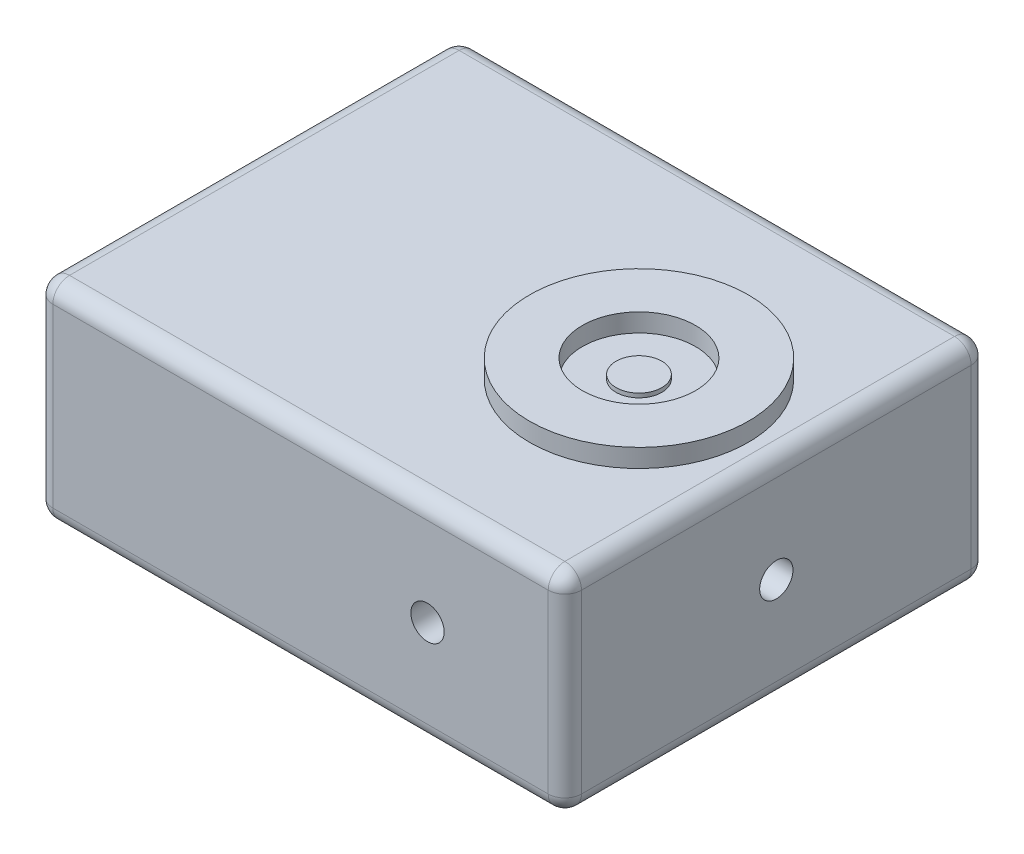
ISO-10303-21;
HEADER;
FILE_DESCRIPTION(('STEP AP214'),'2;1');
FILE_NAME('part.step','',(''),(''),'','','');
FILE_SCHEMA(('AUTOMOTIVE_DESIGN { 1 0 10303 214 1 1 1 1 }'));
ENDSEC;
DATA;
#1=APPLICATION_CONTEXT('core data for automotive mechanical design processes');
#2=APPLICATION_PROTOCOL_DEFINITION('international standard','automotive_design',2000,#1);
#3=PRODUCT_CONTEXT('',#1,'mechanical');
#4=PRODUCT('Part','Part','',(#3));
#5=PRODUCT_RELATED_PRODUCT_CATEGORY('part','',(#4));
#6=PRODUCT_DEFINITION_FORMATION('','',#4);
#7=PRODUCT_DEFINITION_CONTEXT('part definition',#1,'design');
#8=PRODUCT_DEFINITION('design','',#6,#7);
#9=PRODUCT_DEFINITION_SHAPE('','',#8);
#10=(LENGTH_UNIT() NAMED_UNIT(*) SI_UNIT(.MILLI.,.METRE.));
#11=(NAMED_UNIT(*) PLANE_ANGLE_UNIT() SI_UNIT($,.RADIAN.));
#12=(NAMED_UNIT(*) SI_UNIT($,.STERADIAN.) SOLID_ANGLE_UNIT());
#13=UNCERTAINTY_MEASURE_WITH_UNIT(LENGTH_MEASURE(1.E-05),#10,'distance_accuracy_value','');
#14=(GEOMETRIC_REPRESENTATION_CONTEXT(3) GLOBAL_UNCERTAINTY_ASSIGNED_CONTEXT((#13)) GLOBAL_UNIT_ASSIGNED_CONTEXT((#10,
#11,#12)) REPRESENTATION_CONTEXT('',''));
#15=CARTESIAN_POINT('',(0.,0.,0.));
#16=DIRECTION('',(0.,0.,1.));
#17=DIRECTION('',(1.,0.,0.));
#18=AXIS2_PLACEMENT_3D('',#15,#16,#17);
#19=CARTESIAN_POINT('',(-31.75,25.2,-25.4));
#20=DIRECTION('',(0.,0.,1.));
#21=DIRECTION('',(1.,0.,0.));
#22=AXIS2_PLACEMENT_3D('',#19,#20,#21);
#23=PLANE('',#22);
#24=CARTESIAN_POINT('',(15.25,12.6,-25.4));
#25=DIRECTION('',(0.,0.,-1.));
#26=DIRECTION('',(-1.,0.,0.));
#27=AXIS2_PLACEMENT_3D('',#24,#25,#26);
#28=CIRCLE('',#27,2.);
#29=CARTESIAN_POINT('',(13.25,12.6,-25.4));
#30=VERTEX_POINT('',#29);
#31=EDGE_CURVE('E184',#30,#30,#28,.T.);
#32=ORIENTED_EDGE('',*,*,#31,.F.);
#33=EDGE_LOOP('',(#32));
#34=FACE_BOUND('',#33,.T.);
#35=DIRECTION('',(-1.,0.,0.));
#36=VECTOR('',#35,1.);
#37=CARTESIAN_POINT('',(-31.75,2.,-25.4));
#38=LINE('',#37,#36);
#39=CARTESIAN_POINT('',(29.75,2.,-25.4));
#40=VERTEX_POINT('',#39);
#41=CARTESIAN_POINT('',(-29.75,2.,-25.4));
#42=VERTEX_POINT('',#41);
#43=EDGE_CURVE('E233',#40,#42,#38,.T.);
#44=ORIENTED_EDGE('',*,*,#43,.T.);
#45=DIRECTION('',(0.,-1.,0.));
#46=VECTOR('',#45,1.);
#47=CARTESIAN_POINT('',(-29.75,25.2,-25.4));
#48=LINE('',#47,#46);
#49=CARTESIAN_POINT('',(-29.75,23.2,-25.4));
#50=VERTEX_POINT('',#49);
#51=EDGE_CURVE('E236',#42,#50,#48,.F.);
#52=ORIENTED_EDGE('',*,*,#51,.T.);
#53=DIRECTION('',(-1.,0.,0.));
#54=VECTOR('',#53,1.);
#55=CARTESIAN_POINT('',(-31.75,23.2,-25.4));
#56=LINE('',#55,#54);
#57=CARTESIAN_POINT('',(29.75,23.2,-25.4));
#58=VERTEX_POINT('',#57);
#59=EDGE_CURVE('E231',#50,#58,#56,.F.);
#60=ORIENTED_EDGE('',*,*,#59,.T.);
#61=DIRECTION('',(0.,-1.,0.));
#62=VECTOR('',#61,1.);
#63=CARTESIAN_POINT('',(29.75,25.2,-25.4));
#64=LINE('',#63,#62);
#65=EDGE_CURVE('E229',#58,#40,#64,.T.);
#66=ORIENTED_EDGE('',*,*,#65,.T.);
#67=EDGE_LOOP('',(#44,#52,#60,#66));
#68=FACE_BOUND('',#67,.T.);
#69=DIRECTION('',(0.,1.,0.));
#70=VECTOR('',#69,1.);
#71=CARTESIAN_POINT('',(-25.25,2.5,-25.4));
#72=LINE('',#71,#70);
#73=CARTESIAN_POINT('',(-25.25,2.5,-25.4));
#74=VERTEX_POINT('',#73);
#75=CARTESIAN_POINT('',(-25.25,14.5,-25.4));
#76=VERTEX_POINT('',#75);
#77=EDGE_CURVE('E171',#74,#76,#72,.T.);
#78=ORIENTED_EDGE('',*,*,#77,.F.);
#79=DIRECTION('',(-1.,0.,0.));
#80=VECTOR('',#79,1.);
#81=CARTESIAN_POINT('',(-7.25,2.5,-25.4));
#82=LINE('',#81,#80);
#83=CARTESIAN_POINT('',(-7.25,2.5,-25.4));
#84=VERTEX_POINT('',#83);
#85=EDGE_CURVE('E168',#84,#74,#82,.T.);
#86=ORIENTED_EDGE('',*,*,#85,.F.);
#87=DIRECTION('',(0.,-1.,0.));
#88=VECTOR('',#87,1.);
#89=CARTESIAN_POINT('',(-7.25,2.5,-25.4));
#90=LINE('',#89,#88);
#91=CARTESIAN_POINT('',(-7.25,14.5,-25.4));
#92=VERTEX_POINT('',#91);
#93=EDGE_CURVE('E58',#92,#84,#90,.T.);
#94=ORIENTED_EDGE('',*,*,#93,.F.);
#95=DIRECTION('',(1.,0.,0.));
#96=VECTOR('',#95,1.);
#97=CARTESIAN_POINT('',(-7.25,14.5,-25.4));
#98=LINE('',#97,#96);
#99=EDGE_CURVE('E53',#76,#92,#98,.T.);
#100=ORIENTED_EDGE('',*,*,#99,.F.);
#101=EDGE_LOOP('',(#78,#86,#94,#100));
#102=FACE_BOUND('',#101,.T.);
#103=ADVANCED_FACE('F38',(#34,#68,#102),#23,.F.);
#104=CARTESIAN_POINT('',(31.75,25.2,25.4));
#105=DIRECTION('',(-1.,0.,0.));
#106=DIRECTION('',(0.,0.,1.));
#107=AXIS2_PLACEMENT_3D('',#104,#105,#106);
#108=PLANE('',#107);
#109=DIRECTION('',(0.,-1.,0.));
#110=VECTOR('',#109,1.);
#111=CARTESIAN_POINT('',(31.75,25.2,23.4));
#112=LINE('',#111,#110);
#113=CARTESIAN_POINT('',(31.75,23.2,23.4));
#114=VERTEX_POINT('',#113);
#115=CARTESIAN_POINT('',(31.75,2.,23.4));
#116=VERTEX_POINT('',#115);
#117=EDGE_CURVE('E215',#114,#116,#112,.T.);
#118=ORIENTED_EDGE('',*,*,#117,.T.);
#119=DIRECTION('',(0.,0.,-1.));
#120=VECTOR('',#119,1.);
#121=CARTESIAN_POINT('',(31.75,2.,-25.4));
#122=LINE('',#121,#120);
#123=CARTESIAN_POINT('',(31.75,2.,-23.4));
#124=VERTEX_POINT('',#123);
#125=EDGE_CURVE('E217',#116,#124,#122,.T.);
#126=ORIENTED_EDGE('',*,*,#125,.T.);
#127=DIRECTION('',(0.,-1.,0.));
#128=VECTOR('',#127,1.);
#129=CARTESIAN_POINT('',(31.75,25.2,-23.4));
#130=LINE('',#129,#128);
#131=CARTESIAN_POINT('',(31.75,23.2,-23.4));
#132=VERTEX_POINT('',#131);
#133=EDGE_CURVE('E213',#124,#132,#130,.F.);
#134=ORIENTED_EDGE('',*,*,#133,.T.);
#135=DIRECTION('',(0.,0.,-1.));
#136=VECTOR('',#135,1.);
#137=CARTESIAN_POINT('',(31.75,23.2,25.4));
#138=LINE('',#137,#136);
#139=EDGE_CURVE('E211',#132,#114,#138,.F.);
#140=ORIENTED_EDGE('',*,*,#139,.T.);
#141=EDGE_LOOP('',(#118,#126,#134,#140));
#142=FACE_BOUND('',#141,.T.);
#143=CARTESIAN_POINT('',(31.75,12.6,0.));
#144=DIRECTION('',(1.,0.,0.));
#145=DIRECTION('',(0.,0.,-1.));
#146=AXIS2_PLACEMENT_3D('',#143,#144,#145);
#147=CIRCLE('',#146,2.);
#148=CARTESIAN_POINT('',(31.75,12.6,-2.));
#149=VERTEX_POINT('',#148);
#150=EDGE_CURVE('E183',#149,#149,#147,.T.);
#151=ORIENTED_EDGE('',*,*,#150,.F.);
#152=EDGE_LOOP('',(#151));
#153=FACE_BOUND('',#152,.T.);
#154=ADVANCED_FACE('F383',(#142,#153),#108,.F.);
#155=CARTESIAN_POINT('',(-31.75,25.2,25.4));
#156=DIRECTION('',(1.,0.,0.));
#157=DIRECTION('',(0.,0.,-1.));
#158=AXIS2_PLACEMENT_3D('',#155,#156,#157);
#159=PLANE('',#158);
#160=DIRECTION('',(0.,0.,1.));
#161=VECTOR('',#160,1.);
#162=CARTESIAN_POINT('',(-31.75,2.,25.4));
#163=LINE('',#162,#161);
#164=CARTESIAN_POINT('',(-31.75,2.,-23.4));
#165=VERTEX_POINT('',#164);
#166=CARTESIAN_POINT('',(-31.75,2.,23.4));
#167=VERTEX_POINT('',#166);
#168=EDGE_CURVE('E242',#165,#167,#163,.T.);
#169=ORIENTED_EDGE('',*,*,#168,.T.);
#170=DIRECTION('',(0.,-1.,0.));
#171=VECTOR('',#170,1.);
#172=CARTESIAN_POINT('',(-31.75,25.2,23.4));
#173=LINE('',#172,#171);
#174=CARTESIAN_POINT('',(-31.75,23.2,23.4));
#175=VERTEX_POINT('',#174);
#176=EDGE_CURVE('E245',#167,#175,#173,.F.);
#177=ORIENTED_EDGE('',*,*,#176,.T.);
#178=DIRECTION('',(0.,0.,1.));
#179=VECTOR('',#178,1.);
#180=CARTESIAN_POINT('',(-31.75,23.2,25.4));
#181=LINE('',#180,#179);
#182=CARTESIAN_POINT('',(-31.75,23.2,-23.4));
#183=VERTEX_POINT('',#182);
#184=EDGE_CURVE('E240',#175,#183,#181,.F.);
#185=ORIENTED_EDGE('',*,*,#184,.T.);
#186=DIRECTION('',(0.,-1.,0.));
#187=VECTOR('',#186,1.);
#188=CARTESIAN_POINT('',(-31.75,25.2,-23.4));
#189=LINE('',#188,#187);
#190=EDGE_CURVE('E238',#183,#165,#189,.T.);
#191=ORIENTED_EDGE('',*,*,#190,.T.);
#192=EDGE_LOOP('',(#169,#177,#185,#191));
#193=FACE_BOUND('',#192,.T.);
#194=ADVANCED_FACE('F389',(#193),#159,.F.);
#195=CARTESIAN_POINT('',(-31.75,25.2,25.4));
#196=DIRECTION('',(0.,0.,-1.));
#197=DIRECTION('',(-1.,0.,0.));
#198=AXIS2_PLACEMENT_3D('',#195,#196,#197);
#199=PLANE('',#198);
#200=DIRECTION('',(1.,0.,0.));
#201=VECTOR('',#200,1.);
#202=CARTESIAN_POINT('',(31.75,2.,25.4));
#203=LINE('',#202,#201);
#204=CARTESIAN_POINT('',(-29.75,2.,25.4));
#205=VERTEX_POINT('',#204);
#206=CARTESIAN_POINT('',(29.75,2.,25.4));
#207=VERTEX_POINT('',#206);
#208=EDGE_CURVE('E251',#205,#207,#203,.T.);
#209=ORIENTED_EDGE('',*,*,#208,.T.);
#210=DIRECTION('',(0.,-1.,0.));
#211=VECTOR('',#210,1.);
#212=CARTESIAN_POINT('',(29.75,25.2,25.4));
#213=LINE('',#212,#211);
#214=CARTESIAN_POINT('',(29.75,23.2,25.4));
#215=VERTEX_POINT('',#214);
#216=EDGE_CURVE('E254',#207,#215,#213,.F.);
#217=ORIENTED_EDGE('',*,*,#216,.T.);
#218=DIRECTION('',(1.,0.,0.));
#219=VECTOR('',#218,1.);
#220=CARTESIAN_POINT('',(-31.75,23.2,25.4));
#221=LINE('',#220,#219);
#222=CARTESIAN_POINT('',(-29.75,23.2,25.4));
#223=VERTEX_POINT('',#222);
#224=EDGE_CURVE('E249',#215,#223,#221,.F.);
#225=ORIENTED_EDGE('',*,*,#224,.T.);
#226=DIRECTION('',(0.,-1.,0.));
#227=VECTOR('',#226,1.);
#228=CARTESIAN_POINT('',(-29.75,25.2,25.4));
#229=LINE('',#228,#227);
#230=EDGE_CURVE('E247',#223,#205,#229,.T.);
#231=ORIENTED_EDGE('',*,*,#230,.T.);
#232=EDGE_LOOP('',(#209,#217,#225,#231));
#233=FACE_BOUND('',#232,.T.);
#234=CARTESIAN_POINT('',(15.25,12.6,25.4));
#235=DIRECTION('',(0.,0.,1.));
#236=DIRECTION('',(1.,0.,0.));
#237=AXIS2_PLACEMENT_3D('',#234,#235,#236);
#238=CIRCLE('',#237,2.);
#239=CARTESIAN_POINT('',(17.25,12.6,25.4));
#240=VERTEX_POINT('',#239);
#241=EDGE_CURVE('E191',#240,#240,#238,.T.);
#242=ORIENTED_EDGE('',*,*,#241,.F.);
#243=EDGE_LOOP('',(#242));
#244=FACE_BOUND('',#243,.T.);
#245=ADVANCED_FACE('F340',(#233,#244),#199,.F.);
#246=CARTESIAN_POINT('',(0.,25.2,0.));
#247=DIRECTION('',(0.,-1.,0.));
#248=DIRECTION('',(0.,0.,-1.));
#249=AXIS2_PLACEMENT_3D('',#246,#247,#248);
#250=PLANE('',#249);
#251=DIRECTION('',(0.,0.,-1.));
#252=VECTOR('',#251,1.);
#253=CARTESIAN_POINT('',(29.75,25.2,0.));
#254=LINE('',#253,#252);
#255=CARTESIAN_POINT('',(29.75,25.2,23.4));
#256=VERTEX_POINT('',#255);
#257=CARTESIAN_POINT('',(29.75,25.2,-23.4));
#258=VERTEX_POINT('',#257);
#259=EDGE_CURVE('E256',#256,#258,#254,.T.);
#260=ORIENTED_EDGE('',*,*,#259,.T.);
#261=DIRECTION('',(-1.,0.,0.));
#262=VECTOR('',#261,1.);
#263=CARTESIAN_POINT('',(0.,25.2,-23.4));
#264=LINE('',#263,#262);
#265=CARTESIAN_POINT('',(-29.75,25.2,-23.4));
#266=VERTEX_POINT('',#265);
#267=EDGE_CURVE('E46',#258,#266,#264,.T.);
#268=ORIENTED_EDGE('',*,*,#267,.T.);
#269=DIRECTION('',(0.,0.,1.));
#270=VECTOR('',#269,1.);
#271=CARTESIAN_POINT('',(-29.75,25.2,0.));
#272=LINE('',#271,#270);
#273=CARTESIAN_POINT('',(-29.75,25.2,23.4));
#274=VERTEX_POINT('',#273);
#275=EDGE_CURVE('E260',#266,#274,#272,.T.);
#276=ORIENTED_EDGE('',*,*,#275,.T.);
#277=DIRECTION('',(1.,0.,0.));
#278=VECTOR('',#277,1.);
#279=CARTESIAN_POINT('',(0.,25.2,23.4));
#280=LINE('',#279,#278);
#281=EDGE_CURVE('E258',#274,#256,#280,.T.);
#282=ORIENTED_EDGE('',*,*,#281,.T.);
#283=EDGE_LOOP('',(#260,#268,#276,#282));
#284=FACE_BOUND('',#283,.T.);
#285=CARTESIAN_POINT('',(15.25,25.2,0.));
#286=DIRECTION('',(0.,-1.,0.));
#287=DIRECTION('',(0.,0.,-1.));
#288=AXIS2_PLACEMENT_3D('',#285,#286,#287);
#289=CIRCLE('',#288,13.1445);
#290=CARTESIAN_POINT('',(15.25,25.2,-13.1445));
#291=VERTEX_POINT('',#290);
#292=EDGE_CURVE('E208',#291,#291,#289,.F.);
#293=ORIENTED_EDGE('',*,*,#292,.F.);
#294=EDGE_LOOP('',(#293));
#295=FACE_BOUND('',#294,.T.);
#296=ADVANCED_FACE('F350',(#284,#295),#250,.F.);
#297=CARTESIAN_POINT('',(0.,0.,0.));
#298=DIRECTION('',(0.,-1.,0.));
#299=DIRECTION('',(0.,0.,-1.));
#300=AXIS2_PLACEMENT_3D('',#297,#298,#299);
#301=PLANE('',#300);
#302=DIRECTION('',(-1.,0.,0.));
#303=VECTOR('',#302,1.);
#304=CARTESIAN_POINT('',(31.75,0.,-23.4));
#305=LINE('',#304,#303);
#306=CARTESIAN_POINT('',(-29.75,0.,-23.4));
#307=VERTEX_POINT('',#306);
#308=CARTESIAN_POINT('',(29.75,0.,-23.4));
#309=VERTEX_POINT('',#308);
#310=EDGE_CURVE('E224',#307,#309,#305,.F.);
#311=ORIENTED_EDGE('',*,*,#310,.T.);
#312=DIRECTION('',(0.,0.,-1.));
#313=VECTOR('',#312,1.);
#314=CARTESIAN_POINT('',(29.75,0.,25.4));
#315=LINE('',#314,#313);
#316=CARTESIAN_POINT('',(29.75,0.,23.4));
#317=VERTEX_POINT('',#316);
#318=EDGE_CURVE('E226',#309,#317,#315,.F.);
#319=ORIENTED_EDGE('',*,*,#318,.T.);
#320=DIRECTION('',(1.,0.,0.));
#321=VECTOR('',#320,1.);
#322=CARTESIAN_POINT('',(-31.75,0.,23.4));
#323=LINE('',#322,#321);
#324=CARTESIAN_POINT('',(-29.75,0.,23.4));
#325=VERTEX_POINT('',#324);
#326=EDGE_CURVE('E220',#317,#325,#323,.F.);
#327=ORIENTED_EDGE('',*,*,#326,.T.);
#328=DIRECTION('',(0.,0.,1.));
#329=VECTOR('',#328,1.);
#330=CARTESIAN_POINT('',(-29.75,0.,-25.4));
#331=LINE('',#330,#329);
#332=EDGE_CURVE('E222',#325,#307,#331,.F.);
#333=ORIENTED_EDGE('',*,*,#332,.T.);
#334=EDGE_LOOP('',(#311,#319,#327,#333));
#335=FACE_BOUND('',#334,.T.);
#336=ADVANCED_FACE('F720',(#335),#301,.T.);
#337=CARTESIAN_POINT('',(15.25,27.4,0.));
#338=DIRECTION('',(0.,1.,0.));
#339=DIRECTION('',(0.,0.,1.));
#340=AXIS2_PLACEMENT_3D('',#337,#338,#339);
#341=PLANE('',#340);
#342=CARTESIAN_POINT('',(15.25,27.4,0.));
#343=DIRECTION('',(0.,1.,0.));
#344=DIRECTION('',(0.,0.,1.));
#345=AXIS2_PLACEMENT_3D('',#342,#343,#344);
#346=CIRCLE('',#345,13.1445);
#347=CARTESIAN_POINT('',(15.25,27.4,13.1445));
#348=VERTEX_POINT('',#347);
#349=EDGE_CURVE('E203',#348,#348,#346,.T.);
#350=ORIENTED_EDGE('',*,*,#349,.T.);
#351=EDGE_LOOP('',(#350));
#352=FACE_BOUND('',#351,.T.);
#353=CARTESIAN_POINT('',(15.25,27.4,0.));
#354=DIRECTION('',(0.,1.,0.));
#355=DIRECTION('',(0.,0.,1.));
#356=AXIS2_PLACEMENT_3D('',#353,#354,#355);
#357=CIRCLE('',#356,6.7945);
#358=CARTESIAN_POINT('',(15.25,27.4,6.7945));
#359=VERTEX_POINT('',#358);
#360=EDGE_CURVE('E200',#359,#359,#357,.T.);
#361=ORIENTED_EDGE('',*,*,#360,.F.);
#362=EDGE_LOOP('',(#361));
#363=FACE_BOUND('',#362,.T.);
#364=ADVANCED_FACE('F711',(#352,#363),#341,.T.);
#365=CARTESIAN_POINT('',(15.25,27.4,0.));
#366=DIRECTION('',(0.,-1.,0.));
#367=DIRECTION('',(0.,0.,-1.));
#368=AXIS2_PLACEMENT_3D('',#365,#366,#367);
#369=CYLINDRICAL_SURFACE('',#368,13.1445);
#370=ORIENTED_EDGE('',*,*,#349,.F.);
#371=EDGE_LOOP('',(#370));
#372=FACE_BOUND('',#371,.T.);
#373=ORIENTED_EDGE('',*,*,#292,.T.);
#374=EDGE_LOOP('',(#373));
#375=FACE_BOUND('',#374,.T.);
#376=ADVANCED_FACE('F702',(#372,#375),#369,.T.);
#377=CARTESIAN_POINT('',(15.25,27.4,0.));
#378=DIRECTION('',(0.,-1.,0.));
#379=DIRECTION('',(0.,0.,-1.));
#380=AXIS2_PLACEMENT_3D('',#377,#378,#379);
#381=CYLINDRICAL_SURFACE('',#380,6.7945);
#382=ORIENTED_EDGE('',*,*,#360,.T.);
#383=EDGE_LOOP('',(#382));
#384=FACE_BOUND('',#383,.T.);
#385=CARTESIAN_POINT('',(15.25,25.2,0.));
#386=DIRECTION('',(0.,1.,0.));
#387=DIRECTION('',(0.,0.,1.));
#388=AXIS2_PLACEMENT_3D('',#385,#386,#387);
#389=CIRCLE('',#388,6.7945);
#390=CARTESIAN_POINT('',(15.25,25.2,6.7945));
#391=VERTEX_POINT('',#390);
#392=EDGE_CURVE('E197',#391,#391,#389,.T.);
#393=ORIENTED_EDGE('',*,*,#392,.F.);
#394=EDGE_LOOP('',(#393));
#395=FACE_BOUND('',#394,.T.);
#396=ADVANCED_FACE('F697',(#384,#395),#381,.F.);
#397=CARTESIAN_POINT('',(15.25,25.2,0.));
#398=DIRECTION('',(0.,-1.,0.));
#399=DIRECTION('',(0.,0.,-1.));
#400=AXIS2_PLACEMENT_3D('',#397,#398,#399);
#401=CIRCLE('',#400,2.75);
#402=CARTESIAN_POINT('',(15.25,25.2,-2.75));
#403=VERTEX_POINT('',#402);
#404=EDGE_CURVE('E11',#403,#403,#401,.F.);
#405=ORIENTED_EDGE('',*,*,#404,.F.);
#406=EDGE_LOOP('',(#405));
#407=FACE_BOUND('',#406,.T.);
#408=ORIENTED_EDGE('',*,*,#392,.T.);
#409=EDGE_LOOP('',(#408));
#410=FACE_BOUND('',#409,.T.);
#411=ADVANCED_FACE('F692',(#407,#410),#250,.F.);
#412=CARTESIAN_POINT('',(15.25,12.6,19.9));
#413=DIRECTION('',(0.,0.,1.));
#414=DIRECTION('',(1.,0.,0.));
#415=AXIS2_PLACEMENT_3D('',#412,#413,#414);
#416=CYLINDRICAL_SURFACE('',#415,2.);
#417=CARTESIAN_POINT('',(15.25,12.6,19.9));
#418=DIRECTION('',(0.,0.,1.));
#419=DIRECTION('',(1.,0.,0.));
#420=AXIS2_PLACEMENT_3D('',#417,#418,#419);
#421=CIRCLE('',#420,2.);
#422=CARTESIAN_POINT('',(17.25,12.6,19.9));
#423=VERTEX_POINT('',#422);
#424=EDGE_CURVE('E194',#423,#423,#421,.T.);
#425=ORIENTED_EDGE('',*,*,#424,.F.);
#426=EDGE_LOOP('',(#425));
#427=FACE_BOUND('',#426,.T.);
#428=ORIENTED_EDGE('',*,*,#241,.T.);
#429=EDGE_LOOP('',(#428));
#430=FACE_BOUND('',#429,.T.);
#431=ADVANCED_FACE('F683',(#427,#430),#416,.F.);
#432=CARTESIAN_POINT('',(15.25,12.6,19.9));
#433=DIRECTION('',(0.,0.,1.));
#434=DIRECTION('',(1.,0.,0.));
#435=AXIS2_PLACEMENT_3D('',#432,#433,#434);
#436=PLANE('',#435);
#437=ORIENTED_EDGE('',*,*,#424,.T.);
#438=EDGE_LOOP('',(#437));
#439=FACE_BOUND('',#438,.T.);
#440=ADVANCED_FACE('F674',(#439),#436,.T.);
#441=CARTESIAN_POINT('',(26.25,12.6,0.));
#442=DIRECTION('',(1.,0.,0.));
#443=DIRECTION('',(0.,0.,-1.));
#444=AXIS2_PLACEMENT_3D('',#441,#442,#443);
#445=CYLINDRICAL_SURFACE('',#444,2.);
#446=CARTESIAN_POINT('',(26.25,12.6,0.));
#447=DIRECTION('',(1.,0.,0.));
#448=DIRECTION('',(0.,0.,-1.));
#449=AXIS2_PLACEMENT_3D('',#446,#447,#448);
#450=CIRCLE('',#449,2.);
#451=CARTESIAN_POINT('',(26.25,12.6,-2.));
#452=VERTEX_POINT('',#451);
#453=EDGE_CURVE('E188',#452,#452,#450,.T.);
#454=ORIENTED_EDGE('',*,*,#453,.F.);
#455=EDGE_LOOP('',(#454));
#456=FACE_BOUND('',#455,.T.);
#457=ORIENTED_EDGE('',*,*,#150,.T.);
#458=EDGE_LOOP('',(#457));
#459=FACE_BOUND('',#458,.T.);
#460=ADVANCED_FACE('F665',(#456,#459),#445,.F.);
#461=CARTESIAN_POINT('',(26.25,12.6,0.));
#462=DIRECTION('',(1.,0.,0.));
#463=DIRECTION('',(0.,0.,-1.));
#464=AXIS2_PLACEMENT_3D('',#461,#462,#463);
#465=PLANE('',#464);
#466=ORIENTED_EDGE('',*,*,#453,.T.);
#467=EDGE_LOOP('',(#466));
#468=FACE_BOUND('',#467,.T.);
#469=ADVANCED_FACE('F656',(#468),#465,.T.);
#470=CARTESIAN_POINT('',(15.25,12.6,-19.9));
#471=DIRECTION('',(0.,0.,-1.));
#472=DIRECTION('',(-1.,0.,0.));
#473=AXIS2_PLACEMENT_3D('',#470,#471,#472);
#474=CYLINDRICAL_SURFACE('',#473,2.);
#475=CARTESIAN_POINT('',(15.25,12.6,-19.9));
#476=DIRECTION('',(0.,0.,-1.));
#477=DIRECTION('',(-1.,0.,0.));
#478=AXIS2_PLACEMENT_3D('',#475,#476,#477);
#479=CIRCLE('',#478,2.);
#480=CARTESIAN_POINT('',(13.25,12.6,-19.9));
#481=VERTEX_POINT('',#480);
#482=EDGE_CURVE('E180',#481,#481,#479,.T.);
#483=ORIENTED_EDGE('',*,*,#482,.F.);
#484=EDGE_LOOP('',(#483));
#485=FACE_BOUND('',#484,.T.);
#486=ORIENTED_EDGE('',*,*,#31,.T.);
#487=EDGE_LOOP('',(#486));
#488=FACE_BOUND('',#487,.T.);
#489=ADVANCED_FACE('F379',(#485,#488),#474,.F.);
#490=CARTESIAN_POINT('',(15.25,12.6,-19.9));
#491=DIRECTION('',(0.,0.,-1.));
#492=DIRECTION('',(-1.,0.,0.));
#493=AXIS2_PLACEMENT_3D('',#490,#491,#492);
#494=PLANE('',#493);
#495=ORIENTED_EDGE('',*,*,#482,.T.);
#496=EDGE_LOOP('',(#495));
#497=FACE_BOUND('',#496,.T.);
#498=ADVANCED_FACE('F374',(#497),#494,.T.);
#499=CARTESIAN_POINT('',(-29.75,23.2,0.));
#500=DIRECTION('',(0.,0.,1.));
#501=DIRECTION('',(1.,0.,0.));
#502=AXIS2_PLACEMENT_3D('',#499,#500,#501);
#503=CYLINDRICAL_SURFACE('',#502,2.);
#504=CARTESIAN_POINT('',(-29.75,23.2,23.4));
#505=DIRECTION('',(0.,0.,1.));
#506=DIRECTION('',(1.,0.,0.));
#507=AXIS2_PLACEMENT_3D('',#504,#505,#506);
#508=CIRCLE('',#507,2.);
#509=EDGE_CURVE('E187',#274,#175,#508,.T.);
#510=ORIENTED_EDGE('',*,*,#509,.F.);
#511=ORIENTED_EDGE('',*,*,#275,.F.);
#512=CARTESIAN_POINT('',(-29.75,23.2,-23.4));
#513=DIRECTION('',(0.,0.,-1.));
#514=DIRECTION('',(-1.,0.,0.));
#515=AXIS2_PLACEMENT_3D('',#512,#513,#514);
#516=CIRCLE('',#515,2.);
#517=EDGE_CURVE('E321',#183,#266,#516,.T.);
#518=ORIENTED_EDGE('',*,*,#517,.F.);
#519=ORIENTED_EDGE('',*,*,#184,.F.);
#520=EDGE_LOOP('',(#510,#511,#518,#519));
#521=FACE_BOUND('',#520,.T.);
#522=ADVANCED_FACE('F40',(#521),#503,.T.);
#523=CARTESIAN_POINT('',(-29.75,23.2,23.4));
#524=DIRECTION('',(0.,0.,1.));
#525=DIRECTION('',(1.,0.,0.));
#526=AXIS2_PLACEMENT_3D('',#523,#524,#525);
#527=SPHERICAL_SURFACE('',#526,2.);
#528=CARTESIAN_POINT('',(-29.75,23.2,23.4));
#529=DIRECTION('',(-1.,0.,0.));
#530=DIRECTION('',(0.,0.,1.));
#531=AXIS2_PLACEMENT_3D('',#528,#529,#530);
#532=CIRCLE('',#531,2.);
#533=EDGE_CURVE('E315',#274,#223,#532,.F.);
#534=ORIENTED_EDGE('',*,*,#533,.F.);
#535=ORIENTED_EDGE('',*,*,#509,.T.);
#536=CARTESIAN_POINT('',(-29.75,23.2,23.4));
#537=DIRECTION('',(0.,1.,0.));
#538=DIRECTION('',(0.,0.,1.));
#539=AXIS2_PLACEMENT_3D('',#536,#537,#538);
#540=CIRCLE('',#539,2.);
#541=EDGE_CURVE('E318',#223,#175,#540,.F.);
#542=ORIENTED_EDGE('',*,*,#541,.F.);
#543=EDGE_LOOP('',(#534,#535,#542));
#544=FACE_BOUND('',#543,.T.);
#545=ADVANCED_FACE('F328',(#544),#527,.T.);
#546=CARTESIAN_POINT('',(-29.75,23.2,-23.4));
#547=DIRECTION('',(0.,0.,1.));
#548=DIRECTION('',(1.,0.,0.));
#549=AXIS2_PLACEMENT_3D('',#546,#547,#548);
#550=SPHERICAL_SURFACE('',#549,2.);
#551=CARTESIAN_POINT('',(-29.75,23.2,-23.4));
#552=DIRECTION('',(0.,1.,0.));
#553=DIRECTION('',(0.,0.,1.));
#554=AXIS2_PLACEMENT_3D('',#551,#552,#553);
#555=CIRCLE('',#554,2.);
#556=EDGE_CURVE('E310',#183,#50,#555,.F.);
#557=ORIENTED_EDGE('',*,*,#556,.F.);
#558=ORIENTED_EDGE('',*,*,#517,.T.);
#559=CARTESIAN_POINT('',(-29.75,23.2,-23.4));
#560=DIRECTION('',(-1.,0.,0.));
#561=DIRECTION('',(0.,0.,1.));
#562=AXIS2_PLACEMENT_3D('',#559,#560,#561);
#563=CIRCLE('',#562,2.);
#564=EDGE_CURVE('E313',#50,#266,#563,.F.);
#565=ORIENTED_EDGE('',*,*,#564,.F.);
#566=EDGE_LOOP('',(#557,#558,#565));
#567=FACE_BOUND('',#566,.T.);
#568=ADVANCED_FACE('F371',(#567),#550,.T.);
#569=CARTESIAN_POINT('',(-29.75,25.2,23.4));
#570=DIRECTION('',(0.,-1.,0.));
#571=DIRECTION('',(0.,0.,-1.));
#572=AXIS2_PLACEMENT_3D('',#569,#570,#571);
#573=CYLINDRICAL_SURFACE('',#572,2.);
#574=ORIENTED_EDGE('',*,*,#541,.T.);
#575=ORIENTED_EDGE('',*,*,#176,.F.);
#576=CARTESIAN_POINT('',(-29.75,2.,23.4));
#577=DIRECTION('',(0.,-1.,0.));
#578=DIRECTION('',(0.,0.,-1.));
#579=AXIS2_PLACEMENT_3D('',#576,#577,#578);
#580=CIRCLE('',#579,2.);
#581=EDGE_CURVE('E305',#205,#167,#580,.T.);
#582=ORIENTED_EDGE('',*,*,#581,.F.);
#583=ORIENTED_EDGE('',*,*,#230,.F.);
#584=EDGE_LOOP('',(#574,#575,#582,#583));
#585=FACE_BOUND('',#584,.T.);
#586=ADVANCED_FACE('F336',(#585),#573,.T.);
#587=CARTESIAN_POINT('',(0.,23.2,23.4));
#588=DIRECTION('',(1.,0.,0.));
#589=DIRECTION('',(0.,0.,-1.));
#590=AXIS2_PLACEMENT_3D('',#587,#588,#589);
#591=CYLINDRICAL_SURFACE('',#590,2.);
#592=ORIENTED_EDGE('',*,*,#533,.T.);
#593=ORIENTED_EDGE('',*,*,#224,.F.);
#594=CARTESIAN_POINT('',(29.75,23.2,23.4));
#595=DIRECTION('',(1.,0.,0.));
#596=DIRECTION('',(0.,0.,-1.));
#597=AXIS2_PLACEMENT_3D('',#594,#595,#596);
#598=CIRCLE('',#597,2.);
#599=EDGE_CURVE('E302',#256,#215,#598,.T.);
#600=ORIENTED_EDGE('',*,*,#599,.F.);
#601=ORIENTED_EDGE('',*,*,#281,.F.);
#602=EDGE_LOOP('',(#592,#593,#600,#601));
#603=FACE_BOUND('',#602,.T.);
#604=ADVANCED_FACE('F347',(#603),#591,.T.);
#605=CARTESIAN_POINT('',(29.75,23.2,0.));
#606=DIRECTION('',(0.,0.,-1.));
#607=DIRECTION('',(-1.,0.,0.));
#608=AXIS2_PLACEMENT_3D('',#605,#606,#607);
#609=CYLINDRICAL_SURFACE('',#608,2.);
#610=CARTESIAN_POINT('',(29.75,23.2,-23.4));
#611=DIRECTION('',(0.,0.,-1.));
#612=DIRECTION('',(-1.,0.,0.));
#613=AXIS2_PLACEMENT_3D('',#610,#611,#612);
#614=CIRCLE('',#613,2.);
#615=EDGE_CURVE('E296',#258,#132,#614,.T.);
#616=ORIENTED_EDGE('',*,*,#615,.F.);
#617=ORIENTED_EDGE('',*,*,#259,.F.);
#618=CARTESIAN_POINT('',(29.75,23.2,23.4));
#619=DIRECTION('',(0.,0.,1.));
#620=DIRECTION('',(1.,0.,0.));
#621=AXIS2_PLACEMENT_3D('',#618,#619,#620);
#622=CIRCLE('',#621,2.);
#623=EDGE_CURVE('E299',#114,#256,#622,.T.);
#624=ORIENTED_EDGE('',*,*,#623,.F.);
#625=ORIENTED_EDGE('',*,*,#139,.F.);
#626=EDGE_LOOP('',(#616,#617,#624,#625));
#627=FACE_BOUND('',#626,.T.);
#628=ADVANCED_FACE('F356',(#627),#609,.T.);
#629=CARTESIAN_POINT('',(0.,23.2,-23.4));
#630=DIRECTION('',(-1.,0.,0.));
#631=DIRECTION('',(0.,0.,1.));
#632=AXIS2_PLACEMENT_3D('',#629,#630,#631);
#633=CYLINDRICAL_SURFACE('',#632,2.);
#634=ORIENTED_EDGE('',*,*,#564,.T.);
#635=ORIENTED_EDGE('',*,*,#267,.F.);
#636=CARTESIAN_POINT('',(29.75,23.2,-23.4));
#637=DIRECTION('',(1.,0.,0.));
#638=DIRECTION('',(0.,0.,-1.));
#639=AXIS2_PLACEMENT_3D('',#636,#637,#638);
#640=CIRCLE('',#639,2.);
#641=EDGE_CURVE('E293',#58,#258,#640,.T.);
#642=ORIENTED_EDGE('',*,*,#641,.F.);
#643=ORIENTED_EDGE('',*,*,#59,.F.);
#644=EDGE_LOOP('',(#634,#635,#642,#643));
#645=FACE_BOUND('',#644,.T.);
#646=ADVANCED_FACE('F366',(#645),#633,.T.);
#647=CARTESIAN_POINT('',(-29.75,25.2,-23.4));
#648=DIRECTION('',(0.,-1.,0.));
#649=DIRECTION('',(0.,0.,-1.));
#650=AXIS2_PLACEMENT_3D('',#647,#648,#649);
#651=CYLINDRICAL_SURFACE('',#650,2.);
#652=ORIENTED_EDGE('',*,*,#556,.T.);
#653=ORIENTED_EDGE('',*,*,#51,.F.);
#654=CARTESIAN_POINT('',(-29.75,2.,-23.4));
#655=DIRECTION('',(0.,-1.,0.));
#656=DIRECTION('',(0.,0.,-1.));
#657=AXIS2_PLACEMENT_3D('',#654,#655,#656);
#658=CIRCLE('',#657,2.);
#659=EDGE_CURVE('E290',#165,#42,#658,.T.);
#660=ORIENTED_EDGE('',*,*,#659,.F.);
#661=ORIENTED_EDGE('',*,*,#190,.F.);
#662=EDGE_LOOP('',(#652,#653,#660,#661));
#663=FACE_BOUND('',#662,.T.);
#664=ADVANCED_FACE('F442',(#663),#651,.T.);
#665=CARTESIAN_POINT('',(-29.75,2.,25.4));
#666=DIRECTION('',(0.,0.,-1.));
#667=DIRECTION('',(-1.,0.,0.));
#668=AXIS2_PLACEMENT_3D('',#665,#666,#667);
#669=CYLINDRICAL_SURFACE('',#668,2.);
#670=CARTESIAN_POINT('',(-29.75,2.,23.4));
#671=DIRECTION('',(0.,0.,1.));
#672=DIRECTION('',(1.,0.,0.));
#673=AXIS2_PLACEMENT_3D('',#670,#671,#672);
#674=CIRCLE('',#673,2.);
#675=EDGE_CURVE('E307',#167,#325,#674,.T.);
#676=ORIENTED_EDGE('',*,*,#675,.F.);
#677=ORIENTED_EDGE('',*,*,#168,.F.);
#678=CARTESIAN_POINT('',(-29.75,2.,-23.4));
#679=DIRECTION('',(0.,0.,-1.));
#680=DIRECTION('',(-1.,0.,0.));
#681=AXIS2_PLACEMENT_3D('',#678,#679,#680);
#682=CIRCLE('',#681,2.);
#683=EDGE_CURVE('E287',#307,#165,#682,.T.);
#684=ORIENTED_EDGE('',*,*,#683,.F.);
#685=ORIENTED_EDGE('',*,*,#332,.F.);
#686=EDGE_LOOP('',(#676,#677,#684,#685));
#687=FACE_BOUND('',#686,.T.);
#688=ADVANCED_FACE('F438',(#687),#669,.T.);
#689=CARTESIAN_POINT('',(-29.75,2.,23.4));
#690=DIRECTION('',(0.,0.,1.));
#691=DIRECTION('',(1.,0.,0.));
#692=AXIS2_PLACEMENT_3D('',#689,#690,#691);
#693=SPHERICAL_SURFACE('',#692,2.);
#694=ORIENTED_EDGE('',*,*,#581,.T.);
#695=ORIENTED_EDGE('',*,*,#675,.T.);
#696=CARTESIAN_POINT('',(-29.75,2.,23.4));
#697=DIRECTION('',(-1.,0.,0.));
#698=DIRECTION('',(0.,0.,1.));
#699=AXIS2_PLACEMENT_3D('',#696,#697,#698);
#700=CIRCLE('',#699,2.);
#701=EDGE_CURVE('E284',#205,#325,#700,.F.);
#702=ORIENTED_EDGE('',*,*,#701,.F.);
#703=EDGE_LOOP('',(#694,#695,#702));
#704=FACE_BOUND('',#703,.T.);
#705=ADVANCED_FACE('F434',(#704),#693,.T.);
#706=CARTESIAN_POINT('',(29.75,23.2,23.4));
#707=DIRECTION('',(0.,0.,1.));
#708=DIRECTION('',(1.,0.,0.));
#709=AXIS2_PLACEMENT_3D('',#706,#707,#708);
#710=SPHERICAL_SURFACE('',#709,2.);
#711=ORIENTED_EDGE('',*,*,#623,.T.);
#712=ORIENTED_EDGE('',*,*,#599,.T.);
#713=CARTESIAN_POINT('',(29.75,23.2,23.4));
#714=DIRECTION('',(0.,1.,0.));
#715=DIRECTION('',(0.,0.,1.));
#716=AXIS2_PLACEMENT_3D('',#713,#714,#715);
#717=CIRCLE('',#716,2.);
#718=EDGE_CURVE('E281',#114,#215,#717,.F.);
#719=ORIENTED_EDGE('',*,*,#718,.F.);
#720=EDGE_LOOP('',(#711,#712,#719));
#721=FACE_BOUND('',#720,.T.);
#722=ADVANCED_FACE('F431',(#721),#710,.T.);
#723=CARTESIAN_POINT('',(29.75,23.2,-23.4));
#724=DIRECTION('',(0.,0.,1.));
#725=DIRECTION('',(1.,0.,0.));
#726=AXIS2_PLACEMENT_3D('',#723,#724,#725);
#727=SPHERICAL_SURFACE('',#726,2.);
#728=ORIENTED_EDGE('',*,*,#641,.T.);
#729=ORIENTED_EDGE('',*,*,#615,.T.);
#730=CARTESIAN_POINT('',(29.75,23.2,-23.4));
#731=DIRECTION('',(0.,1.,0.));
#732=DIRECTION('',(0.,0.,1.));
#733=AXIS2_PLACEMENT_3D('',#730,#731,#732);
#734=CIRCLE('',#733,2.);
#735=EDGE_CURVE('E278',#58,#132,#734,.F.);
#736=ORIENTED_EDGE('',*,*,#735,.F.);
#737=EDGE_LOOP('',(#728,#729,#736));
#738=FACE_BOUND('',#737,.T.);
#739=ADVANCED_FACE('F362',(#738),#727,.T.);
#740=CARTESIAN_POINT('',(-29.75,2.,-23.4));
#741=DIRECTION('',(0.,0.,1.));
#742=DIRECTION('',(1.,0.,0.));
#743=AXIS2_PLACEMENT_3D('',#740,#741,#742);
#744=SPHERICAL_SURFACE('',#743,2.);
#745=ORIENTED_EDGE('',*,*,#683,.T.);
#746=ORIENTED_EDGE('',*,*,#659,.T.);
#747=CARTESIAN_POINT('',(-29.75,2.,-23.4));
#748=DIRECTION('',(-1.,0.,0.));
#749=DIRECTION('',(0.,0.,1.));
#750=AXIS2_PLACEMENT_3D('',#747,#748,#749);
#751=CIRCLE('',#750,2.);
#752=EDGE_CURVE('E276',#307,#42,#751,.F.);
#753=ORIENTED_EDGE('',*,*,#752,.F.);
#754=EDGE_LOOP('',(#745,#746,#753));
#755=FACE_BOUND('',#754,.T.);
#756=ADVANCED_FACE('F424',(#755),#744,.T.);
#757=CARTESIAN_POINT('',(-31.75,2.,23.4));
#758=DIRECTION('',(-1.,0.,0.));
#759=DIRECTION('',(0.,0.,1.));
#760=AXIS2_PLACEMENT_3D('',#757,#758,#759);
#761=CYLINDRICAL_SURFACE('',#760,2.);
#762=ORIENTED_EDGE('',*,*,#701,.T.);
#763=ORIENTED_EDGE('',*,*,#326,.F.);
#764=CARTESIAN_POINT('',(29.75,2.,23.4));
#765=DIRECTION('',(1.,0.,0.));
#766=DIRECTION('',(0.,0.,-1.));
#767=AXIS2_PLACEMENT_3D('',#764,#765,#766);
#768=CIRCLE('',#767,2.);
#769=EDGE_CURVE('E273',#207,#317,#768,.T.);
#770=ORIENTED_EDGE('',*,*,#769,.F.);
#771=ORIENTED_EDGE('',*,*,#208,.F.);
#772=EDGE_LOOP('',(#762,#763,#770,#771));
#773=FACE_BOUND('',#772,.T.);
#774=ADVANCED_FACE('F420',(#773),#761,.T.);
#775=CARTESIAN_POINT('',(29.75,25.2,23.4));
#776=DIRECTION('',(0.,-1.,0.));
#777=DIRECTION('',(0.,0.,-1.));
#778=AXIS2_PLACEMENT_3D('',#775,#776,#777);
#779=CYLINDRICAL_SURFACE('',#778,2.);
#780=ORIENTED_EDGE('',*,*,#718,.T.);
#781=ORIENTED_EDGE('',*,*,#216,.F.);
#782=CARTESIAN_POINT('',(29.75,2.,23.4));
#783=DIRECTION('',(0.,-1.,0.));
#784=DIRECTION('',(0.,0.,-1.));
#785=AXIS2_PLACEMENT_3D('',#782,#783,#784);
#786=CIRCLE('',#785,2.);
#787=EDGE_CURVE('E271',#116,#207,#786,.T.);
#788=ORIENTED_EDGE('',*,*,#787,.F.);
#789=ORIENTED_EDGE('',*,*,#117,.F.);
#790=EDGE_LOOP('',(#780,#781,#788,#789));
#791=FACE_BOUND('',#790,.T.);
#792=ADVANCED_FACE('F416',(#791),#779,.T.);
#793=CARTESIAN_POINT('',(29.75,25.2,-23.4));
#794=DIRECTION('',(0.,-1.,0.));
#795=DIRECTION('',(0.,0.,-1.));
#796=AXIS2_PLACEMENT_3D('',#793,#794,#795);
#797=CYLINDRICAL_SURFACE('',#796,2.);
#798=ORIENTED_EDGE('',*,*,#735,.T.);
#799=ORIENTED_EDGE('',*,*,#133,.F.);
#800=CARTESIAN_POINT('',(29.75,2.,-23.4));
#801=DIRECTION('',(0.,-1.,0.));
#802=DIRECTION('',(0.,0.,-1.));
#803=AXIS2_PLACEMENT_3D('',#800,#801,#802);
#804=CIRCLE('',#803,2.);
#805=EDGE_CURVE('E268',#40,#124,#804,.T.);
#806=ORIENTED_EDGE('',*,*,#805,.F.);
#807=ORIENTED_EDGE('',*,*,#65,.F.);
#808=EDGE_LOOP('',(#798,#799,#806,#807));
#809=FACE_BOUND('',#808,.T.);
#810=ADVANCED_FACE('F412',(#809),#797,.T.);
#811=CARTESIAN_POINT('',(-31.75,2.,-23.4));
#812=DIRECTION('',(1.,0.,0.));
#813=DIRECTION('',(0.,0.,-1.));
#814=AXIS2_PLACEMENT_3D('',#811,#812,#813);
#815=CYLINDRICAL_SURFACE('',#814,2.);
#816=ORIENTED_EDGE('',*,*,#752,.T.);
#817=ORIENTED_EDGE('',*,*,#43,.F.);
#818=CARTESIAN_POINT('',(29.75,2.,-23.4));
#819=DIRECTION('',(1.,0.,0.));
#820=DIRECTION('',(0.,0.,-1.));
#821=AXIS2_PLACEMENT_3D('',#818,#819,#820);
#822=CIRCLE('',#821,2.);
#823=EDGE_CURVE('E265',#309,#40,#822,.T.);
#824=ORIENTED_EDGE('',*,*,#823,.F.);
#825=ORIENTED_EDGE('',*,*,#310,.F.);
#826=EDGE_LOOP('',(#816,#817,#824,#825));
#827=FACE_BOUND('',#826,.T.);
#828=ADVANCED_FACE('F408',(#827),#815,.T.);
#829=CARTESIAN_POINT('',(29.75,2.,23.4));
#830=DIRECTION('',(0.,0.,1.));
#831=DIRECTION('',(1.,0.,0.));
#832=AXIS2_PLACEMENT_3D('',#829,#830,#831);
#833=SPHERICAL_SURFACE('',#832,2.);
#834=ORIENTED_EDGE('',*,*,#787,.T.);
#835=ORIENTED_EDGE('',*,*,#769,.T.);
#836=CARTESIAN_POINT('',(29.75,2.,23.4));
#837=DIRECTION('',(0.,0.,1.));
#838=DIRECTION('',(1.,0.,0.));
#839=AXIS2_PLACEMENT_3D('',#836,#837,#838);
#840=CIRCLE('',#839,2.);
#841=EDGE_CURVE('E174',#116,#317,#840,.F.);
#842=ORIENTED_EDGE('',*,*,#841,.F.);
#843=EDGE_LOOP('',(#834,#835,#842));
#844=FACE_BOUND('',#843,.T.);
#845=ADVANCED_FACE('F404',(#844),#833,.T.);
#846=CARTESIAN_POINT('',(29.75,2.,-23.4));
#847=DIRECTION('',(0.,0.,1.));
#848=DIRECTION('',(1.,0.,0.));
#849=AXIS2_PLACEMENT_3D('',#846,#847,#848);
#850=SPHERICAL_SURFACE('',#849,2.);
#851=ORIENTED_EDGE('',*,*,#823,.T.);
#852=ORIENTED_EDGE('',*,*,#805,.T.);
#853=CARTESIAN_POINT('',(29.75,2.,-23.4));
#854=DIRECTION('',(0.,0.,-1.));
#855=DIRECTION('',(-1.,0.,0.));
#856=AXIS2_PLACEMENT_3D('',#853,#854,#855);
#857=CIRCLE('',#856,2.);
#858=EDGE_CURVE('E172',#309,#124,#857,.F.);
#859=ORIENTED_EDGE('',*,*,#858,.F.);
#860=EDGE_LOOP('',(#851,#852,#859));
#861=FACE_BOUND('',#860,.T.);
#862=ADVANCED_FACE('F400',(#861),#850,.T.);
#863=CARTESIAN_POINT('',(29.75,2.,25.4));
#864=DIRECTION('',(0.,0.,1.));
#865=DIRECTION('',(1.,0.,0.));
#866=AXIS2_PLACEMENT_3D('',#863,#864,#865);
#867=CYLINDRICAL_SURFACE('',#866,2.);
#868=ORIENTED_EDGE('',*,*,#841,.T.);
#869=ORIENTED_EDGE('',*,*,#318,.F.);
#870=ORIENTED_EDGE('',*,*,#858,.T.);
#871=ORIENTED_EDGE('',*,*,#125,.F.);
#872=EDGE_LOOP('',(#868,#869,#870,#871));
#873=FACE_BOUND('',#872,.T.);
#874=ADVANCED_FACE('F397',(#873),#867,.T.);
#875=CARTESIAN_POINT('',(-25.25,2.5,-26.4));
#876=DIRECTION('',(1.,0.,0.));
#877=DIRECTION('',(0.,0.,-1.));
#878=AXIS2_PLACEMENT_3D('',#875,#876,#877);
#879=PLANE('',#878);
#880=ORIENTED_EDGE('',*,*,#77,.T.);
#881=DIRECTION('',(0.,0.,1.));
#882=VECTOR('',#881,1.);
#883=CARTESIAN_POINT('',(-25.25,14.5,-26.4));
#884=LINE('',#883,#882);
#885=CARTESIAN_POINT('',(-25.25,14.5,-26.4));
#886=VERTEX_POINT('',#885);
#887=EDGE_CURVE('E152',#886,#76,#884,.T.);
#888=ORIENTED_EDGE('',*,*,#887,.F.);
#889=DIRECTION('',(0.,1.,0.));
#890=VECTOR('',#889,1.);
#891=CARTESIAN_POINT('',(-25.25,2.5,-26.4));
#892=LINE('',#891,#890);
#893=CARTESIAN_POINT('',(-25.25,2.5,-26.4));
#894=VERTEX_POINT('',#893);
#895=EDGE_CURVE('E159',#894,#886,#892,.T.);
#896=ORIENTED_EDGE('',*,*,#895,.F.);
#897=DIRECTION('',(0.,0.,1.));
#898=VECTOR('',#897,1.);
#899=CARTESIAN_POINT('',(-25.25,2.5,-26.4));
#900=LINE('',#899,#898);
#901=EDGE_CURVE('E799',#894,#74,#900,.T.);
#902=ORIENTED_EDGE('',*,*,#901,.T.);
#903=EDGE_LOOP('',(#880,#888,#896,#902));
#904=FACE_BOUND('',#903,.T.);
#905=ADVANCED_FACE('F170',(#904),#879,.F.);
#906=CARTESIAN_POINT('',(-7.25,14.5,-26.4));
#907=DIRECTION('',(0.,-1.,0.));
#908=DIRECTION('',(0.,0.,-1.));
#909=AXIS2_PLACEMENT_3D('',#906,#907,#908);
#910=PLANE('',#909);
#911=ORIENTED_EDGE('',*,*,#99,.T.);
#912=DIRECTION('',(0.,0.,1.));
#913=VECTOR('',#912,1.);
#914=CARTESIAN_POINT('',(-7.25,14.5,-26.4));
#915=LINE('',#914,#913);
#916=CARTESIAN_POINT('',(-7.25,14.5,-26.4));
#917=VERTEX_POINT('',#916);
#918=EDGE_CURVE('E155',#917,#92,#915,.T.);
#919=ORIENTED_EDGE('',*,*,#918,.F.);
#920=DIRECTION('',(1.,0.,0.));
#921=VECTOR('',#920,1.);
#922=CARTESIAN_POINT('',(-7.25,14.5,-26.4));
#923=LINE('',#922,#921);
#924=EDGE_CURVE('E148',#886,#917,#923,.T.);
#925=ORIENTED_EDGE('',*,*,#924,.F.);
#926=ORIENTED_EDGE('',*,*,#887,.T.);
#927=EDGE_LOOP('',(#911,#919,#925,#926));
#928=FACE_BOUND('',#927,.T.);
#929=ADVANCED_FACE('F150',(#928),#910,.F.);
#930=CARTESIAN_POINT('',(-7.25,2.5,-26.4));
#931=DIRECTION('',(-1.,0.,0.));
#932=DIRECTION('',(0.,0.,1.));
#933=AXIS2_PLACEMENT_3D('',#930,#931,#932);
#934=PLANE('',#933);
#935=ORIENTED_EDGE('',*,*,#93,.T.);
#936=DIRECTION('',(0.,0.,1.));
#937=VECTOR('',#936,1.);
#938=CARTESIAN_POINT('',(-7.25,2.5,-26.4));
#939=LINE('',#938,#937);
#940=CARTESIAN_POINT('',(-7.25,2.5,-26.4));
#941=VERTEX_POINT('',#940);
#942=EDGE_CURVE('E176',#941,#84,#939,.T.);
#943=ORIENTED_EDGE('',*,*,#942,.F.);
#944=DIRECTION('',(0.,-1.,0.));
#945=VECTOR('',#944,1.);
#946=CARTESIAN_POINT('',(-7.25,2.5,-26.4));
#947=LINE('',#946,#945);
#948=EDGE_CURVE('E158',#917,#941,#947,.T.);
#949=ORIENTED_EDGE('',*,*,#948,.F.);
#950=ORIENTED_EDGE('',*,*,#918,.T.);
#951=EDGE_LOOP('',(#935,#943,#949,#950));
#952=FACE_BOUND('',#951,.T.);
#953=ADVANCED_FACE('F540',(#952),#934,.F.);
#954=CARTESIAN_POINT('',(-7.25,2.5,-26.4));
#955=DIRECTION('',(0.,1.,0.));
#956=DIRECTION('',(0.,0.,1.));
#957=AXIS2_PLACEMENT_3D('',#954,#955,#956);
#958=PLANE('',#957);
#959=ORIENTED_EDGE('',*,*,#85,.T.);
#960=ORIENTED_EDGE('',*,*,#901,.F.);
#961=DIRECTION('',(-1.,0.,0.));
#962=VECTOR('',#961,1.);
#963=CARTESIAN_POINT('',(-7.25,2.5,-26.4));
#964=LINE('',#963,#962);
#965=EDGE_CURVE('E164',#941,#894,#964,.T.);
#966=ORIENTED_EDGE('',*,*,#965,.F.);
#967=ORIENTED_EDGE('',*,*,#942,.T.);
#968=EDGE_LOOP('',(#959,#960,#966,#967));
#969=FACE_BOUND('',#968,.T.);
#970=ADVANCED_FACE('F547',(#969),#958,.F.);
#971=CARTESIAN_POINT('',(0.,0.,-26.4));
#972=DIRECTION('',(0.,0.,1.));
#973=DIRECTION('',(1.,0.,0.));
#974=AXIS2_PLACEMENT_3D('',#971,#972,#973);
#975=PLANE('',#974);
#976=ORIENTED_EDGE('',*,*,#895,.T.);
#977=ORIENTED_EDGE('',*,*,#924,.T.);
#978=ORIENTED_EDGE('',*,*,#948,.T.);
#979=ORIENTED_EDGE('',*,*,#965,.T.);
#980=EDGE_LOOP('',(#976,#977,#978,#979));
#981=FACE_BOUND('',#980,.T.);
#982=ADVANCED_FACE('F162',(#981),#975,.F.);
#983=CARTESIAN_POINT('',(15.25,25.7,0.));
#984=DIRECTION('',(0.,-1.,0.));
#985=DIRECTION('',(0.,0.,-1.));
#986=AXIS2_PLACEMENT_3D('',#983,#984,#985);
#987=CYLINDRICAL_SURFACE('',#986,2.75);
#988=CARTESIAN_POINT('',(15.25,25.7,0.));
#989=DIRECTION('',(0.,1.,0.));
#990=DIRECTION('',(0.,0.,1.));
#991=AXIS2_PLACEMENT_3D('',#988,#989,#990);
#992=CIRCLE('',#991,2.75);
#993=CARTESIAN_POINT('',(15.25,25.7,2.75));
#994=VERTEX_POINT('',#993);
#995=EDGE_CURVE('E796',#994,#994,#992,.T.);
#996=ORIENTED_EDGE('',*,*,#995,.F.);
#997=EDGE_LOOP('',(#996));
#998=FACE_BOUND('',#997,.T.);
#999=ORIENTED_EDGE('',*,*,#404,.T.);
#1000=EDGE_LOOP('',(#999));
#1001=FACE_BOUND('',#1000,.T.);
#1002=ADVANCED_FACE('F562',(#998,#1001),#987,.T.);
#1003=CARTESIAN_POINT('',(15.25,25.7,0.));
#1004=DIRECTION('',(0.,1.,0.));
#1005=DIRECTION('',(0.,0.,1.));
#1006=AXIS2_PLACEMENT_3D('',#1003,#1004,#1005);
#1007=PLANE('',#1006);
#1008=ORIENTED_EDGE('',*,*,#995,.T.);
#1009=EDGE_LOOP('',(#1008));
#1010=FACE_BOUND('',#1009,.T.);
#1011=ADVANCED_FACE('F570',(#1010),#1007,.T.);
#1012=CLOSED_SHELL('',(#103,#154,#194,#245,#296,#336,#364,#376,#396,#411,#431,#440,#460,#469,
#489,#498,#522,#545,#568,#586,#604,#628,#646,#664,#688,#705,#722,#739,#756,#774,#792,#810,#828,
#845,#862,#874,#905,#929,#953,#970,#982,#1002,#1011));
#1013=MANIFOLD_SOLID_BREP('B2',#1012);
#1014=ADVANCED_BREP_SHAPE_REPRESENTATION('',(#18,#1013),#14);
#1015=SHAPE_DEFINITION_REPRESENTATION(#9,#1014);
ENDSEC;
END-ISO-10303-21;
